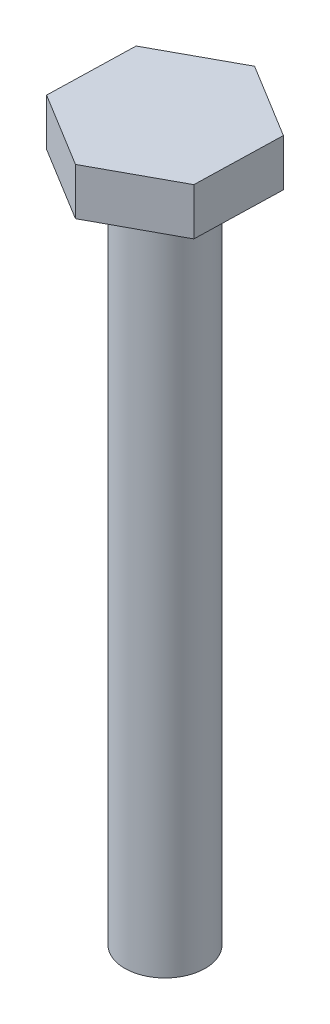
ISO-10303-21;
HEADER;
FILE_DESCRIPTION(('STEP AP214'),'2;1');
FILE_NAME('part.step','',(''),(''),'','','');
FILE_SCHEMA(('AUTOMOTIVE_DESIGN { 1 0 10303 214 1 1 1 1 }'));
ENDSEC;
DATA;
#1=APPLICATION_CONTEXT('core data for automotive mechanical design processes');
#2=APPLICATION_PROTOCOL_DEFINITION('international standard','automotive_design',2000,#1);
#3=PRODUCT_CONTEXT('',#1,'mechanical');
#4=PRODUCT('Part','Part','',(#3));
#5=PRODUCT_RELATED_PRODUCT_CATEGORY('part','',(#4));
#6=PRODUCT_DEFINITION_FORMATION('','',#4);
#7=PRODUCT_DEFINITION_CONTEXT('part definition',#1,'design');
#8=PRODUCT_DEFINITION('design','',#6,#7);
#9=PRODUCT_DEFINITION_SHAPE('','',#8);
#10=(LENGTH_UNIT() NAMED_UNIT(*) SI_UNIT(.MILLI.,.METRE.));
#11=(NAMED_UNIT(*) PLANE_ANGLE_UNIT() SI_UNIT($,.RADIAN.));
#12=(NAMED_UNIT(*) SI_UNIT($,.STERADIAN.) SOLID_ANGLE_UNIT());
#13=UNCERTAINTY_MEASURE_WITH_UNIT(LENGTH_MEASURE(1.E-05),#10,'distance_accuracy_value','');
#14=(GEOMETRIC_REPRESENTATION_CONTEXT(3) GLOBAL_UNCERTAINTY_ASSIGNED_CONTEXT((#13)) GLOBAL_UNIT_ASSIGNED_CONTEXT((#10,
#11,#12)) REPRESENTATION_CONTEXT('',''));
#15=CARTESIAN_POINT('',(0.,0.,0.));
#16=DIRECTION('',(0.,0.,1.));
#17=DIRECTION('',(1.,0.,0.));
#18=AXIS2_PLACEMENT_3D('',#15,#16,#17);
#19=CARTESIAN_POINT('',(-0.167873016872767,3.5,6.49783184225368));
#20=DIRECTION('',(-0.477466711370013,0.,-0.878649838976543));
#21=DIRECTION('',(-0.878649838976543,0.,0.477466711370013));
#22=AXIS2_PLACEMENT_3D('',#19,#20,#21);
#23=PLANE('',#22);
#24=DIRECTION('',(0.878649838976543,0.,-0.477466711370013));
#25=VECTOR('',#24,1.);
#26=CARTESIAN_POINT('',(-0.167873016872767,0.,6.49783184225368));
#27=LINE('',#26,#25);
#28=CARTESIAN_POINT('',(-0.167873016872767,0.,6.49783184225368));
#29=VERTEX_POINT('',#28);
#30=CARTESIAN_POINT('',(5.54335093647476,0.,3.3942982183486));
#31=VERTEX_POINT('',#30);
#32=EDGE_CURVE('E120',#29,#31,#27,.T.);
#33=ORIENTED_EDGE('',*,*,#32,.T.);
#34=DIRECTION('',(0.,-1.,0.));
#35=VECTOR('',#34,1.);
#36=CARTESIAN_POINT('',(5.54335093647476,3.5,3.3942982183486));
#37=LINE('',#36,#35);
#38=CARTESIAN_POINT('',(5.54335093647476,3.5,3.3942982183486));
#39=VERTEX_POINT('',#38);
#40=EDGE_CURVE('E43',#39,#31,#37,.T.);
#41=ORIENTED_EDGE('',*,*,#40,.F.);
#42=DIRECTION('',(0.878649838976543,0.,-0.477466711370013));
#43=VECTOR('',#42,1.);
#44=CARTESIAN_POINT('',(-0.167873016872767,3.5,6.49783184225368));
#45=LINE('',#44,#43);
#46=CARTESIAN_POINT('',(-0.167873016872767,3.5,6.49783184225368));
#47=VERTEX_POINT('',#46);
#48=EDGE_CURVE('E131',#47,#39,#45,.T.);
#49=ORIENTED_EDGE('',*,*,#48,.F.);
#50=DIRECTION('',(0.,-1.,0.));
#51=VECTOR('',#50,1.);
#52=CARTESIAN_POINT('',(-0.167873016872767,3.5,6.49783184225368));
#53=LINE('',#52,#51);
#54=EDGE_CURVE('E116',#47,#29,#53,.T.);
#55=ORIENTED_EDGE('',*,*,#54,.T.);
#56=EDGE_LOOP('',(#33,#41,#49,#55));
#57=FACE_BOUND('',#56,.T.);
#58=ADVANCED_FACE('F35',(#57),#23,.F.);
#59=CARTESIAN_POINT('',(5.54335093647476,3.5,3.3942982183486));
#60=DIRECTION('',(-0.999666437269799,0.,-0.0258266179804261));
#61=DIRECTION('',(-0.0258266179804261,0.,0.999666437269799));
#62=AXIS2_PLACEMENT_3D('',#59,#60,#61);
#63=PLANE('',#62);
#64=DIRECTION('',(0.0258266179804261,0.,-0.999666437269799));
#65=VECTOR('',#64,1.);
#66=CARTESIAN_POINT('',(5.54335093647476,0.,3.3942982183486));
#67=LINE('',#66,#65);
#68=CARTESIAN_POINT('',(5.71122395334753,0.,-3.10353362390509));
#69=VERTEX_POINT('',#68);
#70=EDGE_CURVE('E123',#31,#69,#67,.T.);
#71=ORIENTED_EDGE('',*,*,#70,.T.);
#72=DIRECTION('',(0.,-1.,0.));
#73=VECTOR('',#72,1.);
#74=CARTESIAN_POINT('',(5.71122395334753,3.5,-3.10353362390509));
#75=LINE('',#74,#73);
#76=CARTESIAN_POINT('',(5.71122395334753,3.5,-3.10353362390509));
#77=VERTEX_POINT('',#76);
#78=EDGE_CURVE('E135',#77,#69,#75,.T.);
#79=ORIENTED_EDGE('',*,*,#78,.F.);
#80=DIRECTION('',(0.0258266179804261,0.,-0.999666437269799));
#81=VECTOR('',#80,1.);
#82=CARTESIAN_POINT('',(5.54335093647476,3.5,3.3942982183486));
#83=LINE('',#82,#81);
#84=EDGE_CURVE('E89',#39,#77,#83,.T.);
#85=ORIENTED_EDGE('',*,*,#84,.F.);
#86=ORIENTED_EDGE('',*,*,#40,.T.);
#87=EDGE_LOOP('',(#71,#79,#85,#86));
#88=FACE_BOUND('',#87,.T.);
#89=ADVANCED_FACE('F138',(#88),#63,.F.);
#90=CARTESIAN_POINT('',(5.71122395334753,3.5,-3.10353362390509));
#91=DIRECTION('',(-0.522199725899786,0.,0.852823220996115));
#92=DIRECTION('',(0.852823220996115,0.,0.522199725899786));
#93=AXIS2_PLACEMENT_3D('',#90,#91,#92);
#94=PLANE('',#93);
#95=DIRECTION('',(-0.852823220996115,0.,-0.522199725899786));
#96=VECTOR('',#95,1.);
#97=CARTESIAN_POINT('',(5.71122395334753,0.,-3.10353362390509));
#98=LINE('',#97,#96);
#99=CARTESIAN_POINT('',(0.167873016872779,0.,-6.49783184225369));
#100=VERTEX_POINT('',#99);
#101=EDGE_CURVE('E126',#69,#100,#98,.T.);
#102=ORIENTED_EDGE('',*,*,#101,.T.);
#103=DIRECTION('',(0.,-1.,0.));
#104=VECTOR('',#103,1.);
#105=CARTESIAN_POINT('',(0.167873016872779,3.5,-6.49783184225369));
#106=LINE('',#105,#104);
#107=CARTESIAN_POINT('',(0.167873016872779,3.5,-6.49783184225369));
#108=VERTEX_POINT('',#107);
#109=EDGE_CURVE('E111',#108,#100,#106,.T.);
#110=ORIENTED_EDGE('',*,*,#109,.F.);
#111=DIRECTION('',(-0.852823220996115,0.,-0.522199725899786));
#112=VECTOR('',#111,1.);
#113=CARTESIAN_POINT('',(5.71122395334753,3.5,-3.10353362390509));
#114=LINE('',#113,#112);
#115=EDGE_CURVE('E102',#77,#108,#114,.T.);
#116=ORIENTED_EDGE('',*,*,#115,.F.);
#117=ORIENTED_EDGE('',*,*,#78,.T.);
#118=EDGE_LOOP('',(#102,#110,#116,#117));
#119=FACE_BOUND('',#118,.T.);
#120=ADVANCED_FACE('F146',(#119),#94,.F.);
#121=CARTESIAN_POINT('',(0.167873016872779,3.5,-6.49783184225369));
#122=DIRECTION('',(0.477466711370013,0.,0.878649838976543));
#123=DIRECTION('',(0.878649838976543,0.,-0.477466711370013));
#124=AXIS2_PLACEMENT_3D('',#121,#122,#123);
#125=PLANE('',#124);
#126=DIRECTION('',(-0.878649838976543,0.,0.477466711370013));
#127=VECTOR('',#126,1.);
#128=CARTESIAN_POINT('',(0.167873016872779,0.,-6.49783184225369));
#129=LINE('',#128,#127);
#130=CARTESIAN_POINT('',(-5.54335093647474,0.,-3.39429821834861));
#131=VERTEX_POINT('',#130);
#132=EDGE_CURVE('E110',#100,#131,#129,.T.);
#133=ORIENTED_EDGE('',*,*,#132,.T.);
#134=DIRECTION('',(0.,-1.,0.));
#135=VECTOR('',#134,1.);
#136=CARTESIAN_POINT('',(-5.54335093647474,3.5,-3.39429821834861));
#137=LINE('',#136,#135);
#138=CARTESIAN_POINT('',(-5.54335093647474,3.5,-3.39429821834861));
#139=VERTEX_POINT('',#138);
#140=EDGE_CURVE('E107',#139,#131,#137,.T.);
#141=ORIENTED_EDGE('',*,*,#140,.F.);
#142=DIRECTION('',(-0.878649838976543,0.,0.477466711370013));
#143=VECTOR('',#142,1.);
#144=CARTESIAN_POINT('',(0.167873016872779,3.5,-6.49783184225369));
#145=LINE('',#144,#143);
#146=EDGE_CURVE('E96',#108,#139,#145,.T.);
#147=ORIENTED_EDGE('',*,*,#146,.F.);
#148=ORIENTED_EDGE('',*,*,#109,.T.);
#149=EDGE_LOOP('',(#133,#141,#147,#148));
#150=FACE_BOUND('',#149,.T.);
#151=ADVANCED_FACE('F108',(#150),#125,.F.);
#152=CARTESIAN_POINT('',(-5.54335093647474,3.5,-3.39429821834861));
#153=DIRECTION('',(0.999666437269799,0.,0.0258266179804277));
#154=DIRECTION('',(0.0258266179804277,0.,-0.999666437269799));
#155=AXIS2_PLACEMENT_3D('',#152,#153,#154);
#156=PLANE('',#155);
#157=DIRECTION('',(-0.0258266179804277,0.,0.999666437269799));
#158=VECTOR('',#157,1.);
#159=CARTESIAN_POINT('',(-5.54335093647474,0.,-3.39429821834861));
#160=LINE('',#159,#158);
#161=CARTESIAN_POINT('',(-5.71122395334752,0.,3.10353362390507));
#162=VERTEX_POINT('',#161);
#163=EDGE_CURVE('E74',#131,#162,#160,.T.);
#164=ORIENTED_EDGE('',*,*,#163,.T.);
#165=DIRECTION('',(0.,-1.,0.));
#166=VECTOR('',#165,1.);
#167=CARTESIAN_POINT('',(-5.71122395334752,3.5,3.10353362390507));
#168=LINE('',#167,#166);
#169=CARTESIAN_POINT('',(-5.71122395334752,3.5,3.10353362390507));
#170=VERTEX_POINT('',#169);
#171=EDGE_CURVE('E112',#170,#162,#168,.T.);
#172=ORIENTED_EDGE('',*,*,#171,.F.);
#173=DIRECTION('',(-0.0258266179804277,0.,0.999666437269799));
#174=VECTOR('',#173,1.);
#175=CARTESIAN_POINT('',(-5.54335093647474,3.5,-3.39429821834861));
#176=LINE('',#175,#174);
#177=EDGE_CURVE('E100',#139,#170,#176,.T.);
#178=ORIENTED_EDGE('',*,*,#177,.F.);
#179=ORIENTED_EDGE('',*,*,#140,.T.);
#180=EDGE_LOOP('',(#164,#172,#178,#179));
#181=FACE_BOUND('',#180,.T.);
#182=ADVANCED_FACE('F114',(#181),#156,.F.);
#183=CARTESIAN_POINT('',(-5.71122395334752,3.5,3.10353362390507));
#184=DIRECTION('',(0.522199725899786,0.,-0.852823220996115));
#185=DIRECTION('',(-0.852823220996115,0.,-0.522199725899786));
#186=AXIS2_PLACEMENT_3D('',#183,#184,#185);
#187=PLANE('',#186);
#188=DIRECTION('',(0.852823220996115,0.,0.522199725899786));
#189=VECTOR('',#188,1.);
#190=CARTESIAN_POINT('',(-5.71122395334752,0.,3.10353362390507));
#191=LINE('',#190,#189);
#192=EDGE_CURVE('E80',#162,#29,#191,.T.);
#193=ORIENTED_EDGE('',*,*,#192,.T.);
#194=ORIENTED_EDGE('',*,*,#54,.F.);
#195=DIRECTION('',(0.852823220996115,0.,0.522199725899786));
#196=VECTOR('',#195,1.);
#197=CARTESIAN_POINT('',(-5.71122395334752,3.5,3.10353362390507));
#198=LINE('',#197,#196);
#199=EDGE_CURVE('E51',#170,#47,#198,.T.);
#200=ORIENTED_EDGE('',*,*,#199,.F.);
#201=ORIENTED_EDGE('',*,*,#171,.T.);
#202=EDGE_LOOP('',(#193,#194,#200,#201));
#203=FACE_BOUND('',#202,.T.);
#204=ADVANCED_FACE('F168',(#203),#187,.F.);
#205=CARTESIAN_POINT('',(0.,3.5,0.));
#206=DIRECTION('',(0.,1.,0.));
#207=DIRECTION('',(0.,0.,1.));
#208=AXIS2_PLACEMENT_3D('',#205,#206,#207);
#209=PLANE('',#208);
#210=ORIENTED_EDGE('',*,*,#48,.T.);
#211=ORIENTED_EDGE('',*,*,#84,.T.);
#212=ORIENTED_EDGE('',*,*,#115,.T.);
#213=ORIENTED_EDGE('',*,*,#146,.T.);
#214=ORIENTED_EDGE('',*,*,#177,.T.);
#215=ORIENTED_EDGE('',*,*,#199,.T.);
#216=EDGE_LOOP('',(#210,#211,#212,#213,#214,#215));
#217=FACE_BOUND('',#216,.T.);
#218=ADVANCED_FACE('F98',(#217),#209,.T.);
#219=CARTESIAN_POINT('',(0.,0.,0.));
#220=DIRECTION('',(0.,1.,0.));
#221=DIRECTION('',(0.,0.,1.));
#222=AXIS2_PLACEMENT_3D('',#219,#220,#221);
#223=PLANE('',#222);
#224=CARTESIAN_POINT('',(0.,0.,0.));
#225=DIRECTION('',(0.,1.,0.));
#226=DIRECTION('',(0.,0.,1.));
#227=AXIS2_PLACEMENT_3D('',#224,#225,#226);
#228=CIRCLE('',#227,3.);
#229=CARTESIAN_POINT('',(0.,0.,3.));
#230=VERTEX_POINT('',#229);
#231=EDGE_CURVE('E11',#230,#230,#228,.F.);
#232=ORIENTED_EDGE('',*,*,#231,.F.);
#233=EDGE_LOOP('',(#232));
#234=FACE_BOUND('',#233,.T.);
#235=ORIENTED_EDGE('',*,*,#32,.F.);
#236=ORIENTED_EDGE('',*,*,#192,.F.);
#237=ORIENTED_EDGE('',*,*,#163,.F.);
#238=ORIENTED_EDGE('',*,*,#132,.F.);
#239=ORIENTED_EDGE('',*,*,#101,.F.);
#240=ORIENTED_EDGE('',*,*,#70,.F.);
#241=EDGE_LOOP('',(#235,#236,#237,#238,#239,#240));
#242=FACE_BOUND('',#241,.T.);
#243=ADVANCED_FACE('F143',(#234,#242),#223,.F.);
#244=CARTESIAN_POINT('',(0.,-50.,0.));
#245=DIRECTION('',(0.,1.,0.));
#246=DIRECTION('',(0.,0.,1.));
#247=AXIS2_PLACEMENT_3D('',#244,#245,#246);
#248=CYLINDRICAL_SURFACE('',#247,3.);
#249=CARTESIAN_POINT('',(0.,-50.,0.));
#250=DIRECTION('',(0.,-1.,0.));
#251=DIRECTION('',(0.,0.,-1.));
#252=AXIS2_PLACEMENT_3D('',#249,#250,#251);
#253=CIRCLE('',#252,3.);
#254=CARTESIAN_POINT('',(0.,-50.,-3.));
#255=VERTEX_POINT('',#254);
#256=EDGE_CURVE('E124',#255,#255,#253,.T.);
#257=ORIENTED_EDGE('',*,*,#256,.F.);
#258=EDGE_LOOP('',(#257));
#259=FACE_BOUND('',#258,.T.);
#260=ORIENTED_EDGE('',*,*,#231,.T.);
#261=EDGE_LOOP('',(#260));
#262=FACE_BOUND('',#261,.T.);
#263=ADVANCED_FACE('F155',(#259,#262),#248,.T.);
#264=CARTESIAN_POINT('',(0.,-50.,0.));
#265=DIRECTION('',(0.,-1.,0.));
#266=DIRECTION('',(0.,0.,-1.));
#267=AXIS2_PLACEMENT_3D('',#264,#265,#266);
#268=PLANE('',#267);
#269=ORIENTED_EDGE('',*,*,#256,.T.);
#270=EDGE_LOOP('',(#269));
#271=FACE_BOUND('',#270,.T.);
#272=ADVANCED_FACE('F153',(#271),#268,.T.);
#273=CLOSED_SHELL('',(#58,#89,#120,#151,#182,#204,#218,#243,#263,#272));
#274=MANIFOLD_SOLID_BREP('B2',#273);
#275=ADVANCED_BREP_SHAPE_REPRESENTATION('',(#18,#274),#14);
#276=SHAPE_DEFINITION_REPRESENTATION(#9,#275);
ENDSEC;
END-ISO-10303-21;
